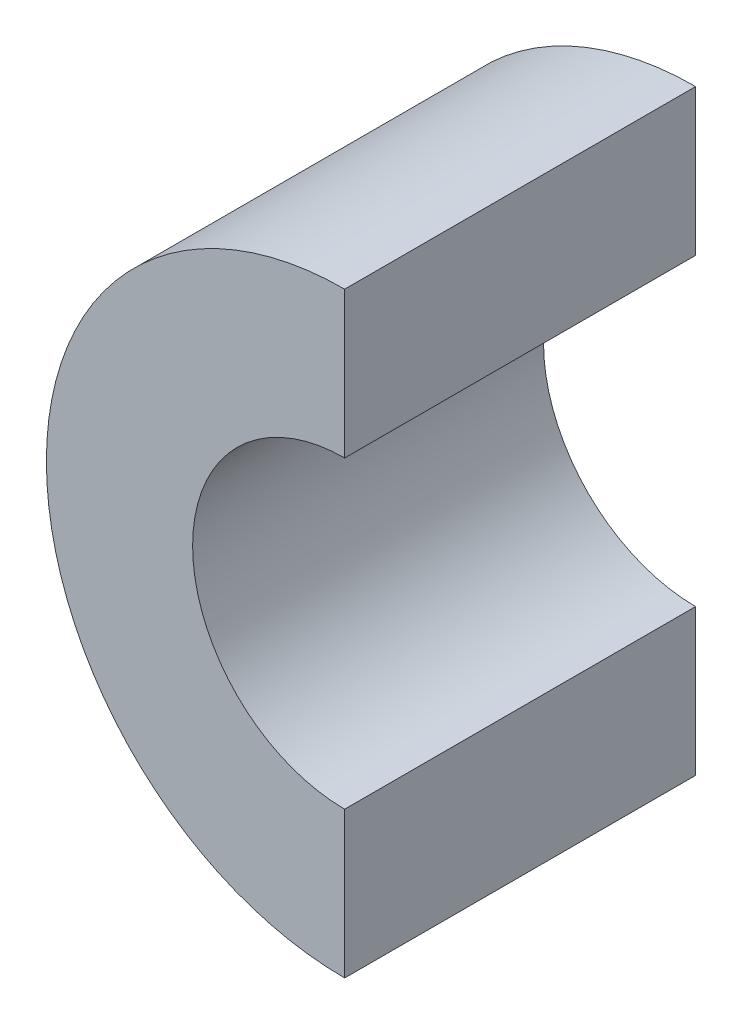
ISO-10303-21;
HEADER;
FILE_DESCRIPTION(('STEP AP214'),'2;1');
FILE_NAME('part.step','',(''),(''),'','','');
FILE_SCHEMA(('AUTOMOTIVE_DESIGN { 1 0 10303 214 1 1 1 1 }'));
ENDSEC;
DATA;
#1=APPLICATION_CONTEXT('core data for automotive mechanical design processes');
#2=APPLICATION_PROTOCOL_DEFINITION('international standard','automotive_design',2000,#1);
#3=PRODUCT_CONTEXT('',#1,'mechanical');
#4=PRODUCT('Part','Part','',(#3));
#5=PRODUCT_RELATED_PRODUCT_CATEGORY('part','',(#4));
#6=PRODUCT_DEFINITION_FORMATION('','',#4);
#7=PRODUCT_DEFINITION_CONTEXT('part definition',#1,'design');
#8=PRODUCT_DEFINITION('design','',#6,#7);
#9=PRODUCT_DEFINITION_SHAPE('','',#8);
#10=(LENGTH_UNIT() NAMED_UNIT(*) SI_UNIT(.MILLI.,.METRE.));
#11=(NAMED_UNIT(*) PLANE_ANGLE_UNIT() SI_UNIT($,.RADIAN.));
#12=(NAMED_UNIT(*) SI_UNIT($,.STERADIAN.) SOLID_ANGLE_UNIT());
#13=UNCERTAINTY_MEASURE_WITH_UNIT(LENGTH_MEASURE(1.E-05),#10,'distance_accuracy_value','');
#14=(GEOMETRIC_REPRESENTATION_CONTEXT(3) GLOBAL_UNCERTAINTY_ASSIGNED_CONTEXT((#13)) GLOBAL_UNIT_ASSIGNED_CONTEXT((#10,
#11,#12)) REPRESENTATION_CONTEXT('',''));
#15=CARTESIAN_POINT('',(0.,0.,0.));
#16=DIRECTION('',(0.,0.,1.));
#17=DIRECTION('',(1.,0.,0.));
#18=AXIS2_PLACEMENT_3D('',#15,#16,#17);
#19=CARTESIAN_POINT('',(0.,0.,12.));
#20=DIRECTION('',(0.,0.,-1.));
#21=DIRECTION('',(-1.,0.,0.));
#22=AXIS2_PLACEMENT_3D('',#19,#20,#21);
#23=CYLINDRICAL_SURFACE('',#22,5.2);
#24=CARTESIAN_POINT('',(0.,0.,0.));
#25=DIRECTION('',(0.,0.,-1.));
#26=DIRECTION('',(1.,0.,0.));
#27=AXIS2_PLACEMENT_3D('',#24,#25,#26);
#28=CIRCLE('',#27,5.2);
#29=CARTESIAN_POINT('',(0.,-5.2,0.));
#30=VERTEX_POINT('',#29);
#31=CARTESIAN_POINT('',(0.,5.2,0.));
#32=VERTEX_POINT('',#31);
#33=EDGE_CURVE('E111',#30,#32,#28,.T.);
#34=ORIENTED_EDGE('',*,*,#33,.T.);
#35=DIRECTION('',(0.,0.,-1.));
#36=VECTOR('',#35,1.);
#37=CARTESIAN_POINT('',(0.,5.2,12.));
#38=LINE('',#37,#36);
#39=CARTESIAN_POINT('',(0.,5.2,12.));
#40=VERTEX_POINT('',#39);
#41=EDGE_CURVE('E11',#40,#32,#38,.T.);
#42=ORIENTED_EDGE('',*,*,#41,.F.);
#43=CARTESIAN_POINT('',(0.,0.,12.));
#44=DIRECTION('',(0.,0.,-1.));
#45=DIRECTION('',(1.,0.,0.));
#46=AXIS2_PLACEMENT_3D('',#43,#44,#45);
#47=CIRCLE('',#46,5.2);
#48=CARTESIAN_POINT('',(0.,-5.2,12.));
#49=VERTEX_POINT('',#48);
#50=EDGE_CURVE('E94',#49,#40,#47,.T.);
#51=ORIENTED_EDGE('',*,*,#50,.F.);
#52=DIRECTION('',(0.,0.,-1.));
#53=VECTOR('',#52,1.);
#54=CARTESIAN_POINT('',(0.,-5.2,12.));
#55=LINE('',#54,#53);
#56=EDGE_CURVE('E107',#49,#30,#55,.T.);
#57=ORIENTED_EDGE('',*,*,#56,.T.);
#58=EDGE_LOOP('',(#34,#42,#51,#57));
#59=FACE_BOUND('',#58,.T.);
#60=ADVANCED_FACE('F42',(#59),#23,.F.);
#61=CARTESIAN_POINT('',(0.,10.2,12.));
#62=DIRECTION('',(-1.,0.,0.));
#63=DIRECTION('',(0.,-1.,0.));
#64=AXIS2_PLACEMENT_3D('',#61,#62,#63);
#65=PLANE('',#64);
#66=DIRECTION('',(0.,1.,0.));
#67=VECTOR('',#66,1.);
#68=CARTESIAN_POINT('',(0.,10.2,0.));
#69=LINE('',#68,#67);
#70=CARTESIAN_POINT('',(0.,10.2,0.));
#71=VERTEX_POINT('',#70);
#72=EDGE_CURVE('E99',#32,#71,#69,.T.);
#73=ORIENTED_EDGE('',*,*,#72,.T.);
#74=DIRECTION('',(0.,0.,-1.));
#75=VECTOR('',#74,1.);
#76=CARTESIAN_POINT('',(0.,10.2,12.));
#77=LINE('',#76,#75);
#78=CARTESIAN_POINT('',(0.,10.2,12.));
#79=VERTEX_POINT('',#78);
#80=EDGE_CURVE('E51',#79,#71,#77,.T.);
#81=ORIENTED_EDGE('',*,*,#80,.F.);
#82=DIRECTION('',(0.,1.,0.));
#83=VECTOR('',#82,1.);
#84=CARTESIAN_POINT('',(0.,10.2,12.));
#85=LINE('',#84,#83);
#86=EDGE_CURVE('E89',#40,#79,#85,.T.);
#87=ORIENTED_EDGE('',*,*,#86,.F.);
#88=ORIENTED_EDGE('',*,*,#41,.T.);
#89=EDGE_LOOP('',(#73,#81,#87,#88));
#90=FACE_BOUND('',#89,.T.);
#91=ADVANCED_FACE('F98',(#90),#65,.F.);
#92=CARTESIAN_POINT('',(0.,0.,12.));
#93=DIRECTION('',(0.,0.,-1.));
#94=DIRECTION('',(-1.,0.,0.));
#95=AXIS2_PLACEMENT_3D('',#92,#93,#94);
#96=CYLINDRICAL_SURFACE('',#95,10.2);
#97=CARTESIAN_POINT('',(0.,0.,0.));
#98=DIRECTION('',(0.,0.,1.));
#99=DIRECTION('',(1.,0.,0.));
#100=AXIS2_PLACEMENT_3D('',#97,#98,#99);
#101=CIRCLE('',#100,10.2);
#102=CARTESIAN_POINT('',(0.,-10.2,0.));
#103=VERTEX_POINT('',#102);
#104=EDGE_CURVE('E76',#71,#103,#101,.T.);
#105=ORIENTED_EDGE('',*,*,#104,.T.);
#106=DIRECTION('',(0.,0.,-1.));
#107=VECTOR('',#106,1.);
#108=CARTESIAN_POINT('',(0.,-10.2,12.));
#109=LINE('',#108,#107);
#110=CARTESIAN_POINT('',(0.,-10.2,12.));
#111=VERTEX_POINT('',#110);
#112=EDGE_CURVE('E101',#111,#103,#109,.T.);
#113=ORIENTED_EDGE('',*,*,#112,.F.);
#114=CARTESIAN_POINT('',(0.,0.,12.));
#115=DIRECTION('',(0.,0.,1.));
#116=DIRECTION('',(1.,0.,0.));
#117=AXIS2_PLACEMENT_3D('',#114,#115,#116);
#118=CIRCLE('',#117,10.2);
#119=EDGE_CURVE('E92',#79,#111,#118,.T.);
#120=ORIENTED_EDGE('',*,*,#119,.F.);
#121=ORIENTED_EDGE('',*,*,#80,.T.);
#122=EDGE_LOOP('',(#105,#113,#120,#121));
#123=FACE_BOUND('',#122,.T.);
#124=ADVANCED_FACE('F102',(#123),#96,.T.);
#125=CARTESIAN_POINT('',(0.,-5.2,12.));
#126=DIRECTION('',(-1.,0.,0.));
#127=DIRECTION('',(0.,-1.,0.));
#128=AXIS2_PLACEMENT_3D('',#125,#126,#127);
#129=PLANE('',#128);
#130=DIRECTION('',(0.,1.,0.));
#131=VECTOR('',#130,1.);
#132=CARTESIAN_POINT('',(0.,-5.2,0.));
#133=LINE('',#132,#131);
#134=EDGE_CURVE('E82',#103,#30,#133,.T.);
#135=ORIENTED_EDGE('',*,*,#134,.T.);
#136=ORIENTED_EDGE('',*,*,#56,.F.);
#137=DIRECTION('',(0.,1.,0.));
#138=VECTOR('',#137,1.);
#139=CARTESIAN_POINT('',(0.,-5.2,12.));
#140=LINE('',#139,#138);
#141=EDGE_CURVE('E59',#111,#49,#140,.T.);
#142=ORIENTED_EDGE('',*,*,#141,.F.);
#143=ORIENTED_EDGE('',*,*,#112,.T.);
#144=EDGE_LOOP('',(#135,#136,#142,#143));
#145=FACE_BOUND('',#144,.T.);
#146=ADVANCED_FACE('F125',(#145),#129,.F.);
#147=CARTESIAN_POINT('',(0.,0.,12.));
#148=DIRECTION('',(0.,0.,1.));
#149=DIRECTION('',(1.,0.,0.));
#150=AXIS2_PLACEMENT_3D('',#147,#148,#149);
#151=PLANE('',#150);
#152=ORIENTED_EDGE('',*,*,#50,.T.);
#153=ORIENTED_EDGE('',*,*,#86,.T.);
#154=ORIENTED_EDGE('',*,*,#119,.T.);
#155=ORIENTED_EDGE('',*,*,#141,.T.);
#156=EDGE_LOOP('',(#152,#153,#154,#155));
#157=FACE_BOUND('',#156,.T.);
#158=ADVANCED_FACE('F90',(#157),#151,.T.);
#159=CARTESIAN_POINT('',(0.,0.,0.));
#160=DIRECTION('',(0.,0.,1.));
#161=DIRECTION('',(1.,0.,0.));
#162=AXIS2_PLACEMENT_3D('',#159,#160,#161);
#163=PLANE('',#162);
#164=ORIENTED_EDGE('',*,*,#33,.F.);
#165=ORIENTED_EDGE('',*,*,#134,.F.);
#166=ORIENTED_EDGE('',*,*,#104,.F.);
#167=ORIENTED_EDGE('',*,*,#72,.F.);
#168=EDGE_LOOP('',(#164,#165,#166,#167));
#169=FACE_BOUND('',#168,.T.);
#170=ADVANCED_FACE('F128',(#169),#163,.F.);
#171=CLOSED_SHELL('',(#60,#91,#124,#146,#158,#170));
#172=MANIFOLD_SOLID_BREP('B2',#171);
#173=ADVANCED_BREP_SHAPE_REPRESENTATION('',(#18,#172),#14);
#174=SHAPE_DEFINITION_REPRESENTATION(#9,#173);
ENDSEC;
END-ISO-10303-21;
